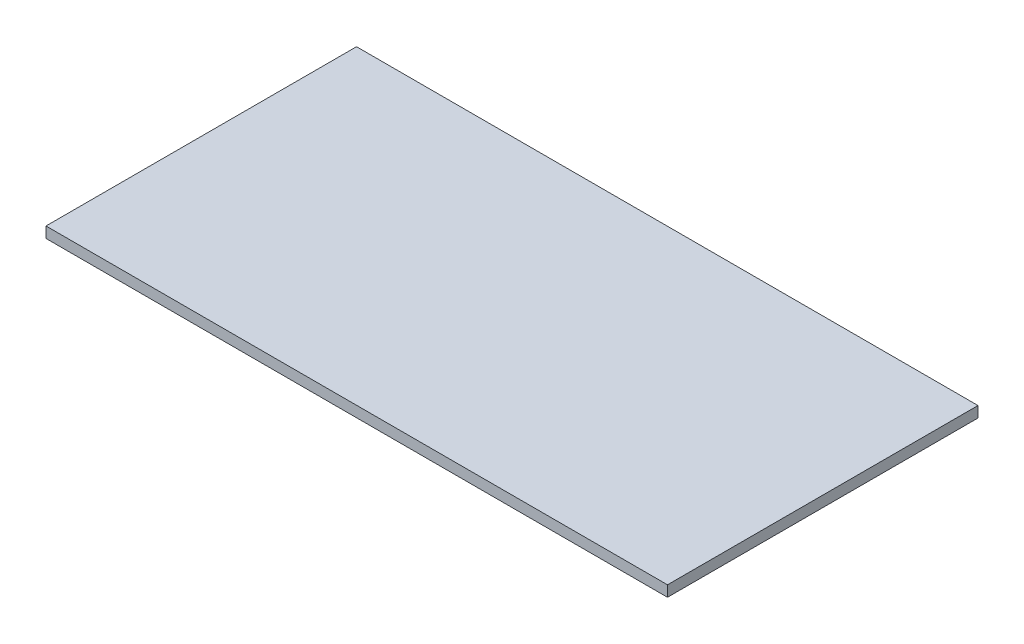
ISO-10303-21;
HEADER;
FILE_DESCRIPTION(('STEP AP214'),'2;1');
FILE_NAME('part.step','',(''),(''),'','','');
FILE_SCHEMA(('AUTOMOTIVE_DESIGN { 1 0 10303 214 1 1 1 1 }'));
ENDSEC;
DATA;
#1=APPLICATION_CONTEXT('core data for automotive mechanical design processes');
#2=APPLICATION_PROTOCOL_DEFINITION('international standard','automotive_design',2000,#1);
#3=PRODUCT_CONTEXT('',#1,'mechanical');
#4=PRODUCT('Part','Part','',(#3));
#5=PRODUCT_RELATED_PRODUCT_CATEGORY('part','',(#4));
#6=PRODUCT_DEFINITION_FORMATION('','',#4);
#7=PRODUCT_DEFINITION_CONTEXT('part definition',#1,'design');
#8=PRODUCT_DEFINITION('design','',#6,#7);
#9=PRODUCT_DEFINITION_SHAPE('','',#8);
#10=(LENGTH_UNIT() NAMED_UNIT(*) SI_UNIT(.MILLI.,.METRE.));
#11=(NAMED_UNIT(*) PLANE_ANGLE_UNIT() SI_UNIT($,.RADIAN.));
#12=(NAMED_UNIT(*) SI_UNIT($,.STERADIAN.) SOLID_ANGLE_UNIT());
#13=UNCERTAINTY_MEASURE_WITH_UNIT(LENGTH_MEASURE(1.E-05),#10,'distance_accuracy_value','');
#14=(GEOMETRIC_REPRESENTATION_CONTEXT(3) GLOBAL_UNCERTAINTY_ASSIGNED_CONTEXT((#13)) GLOBAL_UNIT_ASSIGNED_CONTEXT((#10,
#11,#12)) REPRESENTATION_CONTEXT('',''));
#15=CARTESIAN_POINT('',(0.,0.,0.));
#16=DIRECTION('',(0.,0.,1.));
#17=DIRECTION('',(1.,0.,0.));
#18=AXIS2_PLACEMENT_3D('',#15,#16,#17);
#19=CARTESIAN_POINT('',(65.95,2.3,-32.95));
#20=DIRECTION('',(-1.,0.,0.));
#21=DIRECTION('',(0.,0.,1.));
#22=AXIS2_PLACEMENT_3D('',#19,#20,#21);
#23=PLANE('',#22);
#24=DIRECTION('',(0.,0.,-1.));
#25=VECTOR('',#24,1.);
#26=CARTESIAN_POINT('',(65.95,0.,-32.95));
#27=LINE('',#26,#25);
#28=CARTESIAN_POINT('',(65.95,0.,32.95));
#29=VERTEX_POINT('',#28);
#30=CARTESIAN_POINT('',(65.95,0.,-32.95));
#31=VERTEX_POINT('',#30);
#32=EDGE_CURVE('E111',#29,#31,#27,.T.);
#33=ORIENTED_EDGE('',*,*,#32,.T.);
#34=DIRECTION('',(0.,-1.,0.));
#35=VECTOR('',#34,1.);
#36=CARTESIAN_POINT('',(65.95,2.3,-32.95));
#37=LINE('',#36,#35);
#38=CARTESIAN_POINT('',(65.95,2.3,-32.95));
#39=VERTEX_POINT('',#38);
#40=EDGE_CURVE('E11',#39,#31,#37,.T.);
#41=ORIENTED_EDGE('',*,*,#40,.F.);
#42=DIRECTION('',(0.,0.,-1.));
#43=VECTOR('',#42,1.);
#44=CARTESIAN_POINT('',(65.95,2.3,-32.95));
#45=LINE('',#44,#43);
#46=CARTESIAN_POINT('',(65.95,2.3,32.95));
#47=VERTEX_POINT('',#46);
#48=EDGE_CURVE('E95',#47,#39,#45,.T.);
#49=ORIENTED_EDGE('',*,*,#48,.F.);
#50=DIRECTION('',(0.,-1.,0.));
#51=VECTOR('',#50,1.);
#52=CARTESIAN_POINT('',(65.95,2.3,32.95));
#53=LINE('',#52,#51);
#54=EDGE_CURVE('E107',#47,#29,#53,.T.);
#55=ORIENTED_EDGE('',*,*,#54,.T.);
#56=EDGE_LOOP('',(#33,#41,#49,#55));
#57=FACE_BOUND('',#56,.T.);
#58=ADVANCED_FACE('F43',(#57),#23,.F.);
#59=CARTESIAN_POINT('',(-65.95,2.3,-32.95));
#60=DIRECTION('',(0.,0.,1.));
#61=DIRECTION('',(1.,0.,0.));
#62=AXIS2_PLACEMENT_3D('',#59,#60,#61);
#63=PLANE('',#62);
#64=DIRECTION('',(-1.,0.,0.));
#65=VECTOR('',#64,1.);
#66=CARTESIAN_POINT('',(-65.95,0.,-32.95));
#67=LINE('',#66,#65);
#68=CARTESIAN_POINT('',(-65.95,0.,-32.95));
#69=VERTEX_POINT('',#68);
#70=EDGE_CURVE('E100',#31,#69,#67,.T.);
#71=ORIENTED_EDGE('',*,*,#70,.T.);
#72=DIRECTION('',(0.,-1.,0.));
#73=VECTOR('',#72,1.);
#74=CARTESIAN_POINT('',(-65.95,2.3,-32.95));
#75=LINE('',#74,#73);
#76=CARTESIAN_POINT('',(-65.95,2.3,-32.95));
#77=VERTEX_POINT('',#76);
#78=EDGE_CURVE('E52',#77,#69,#75,.T.);
#79=ORIENTED_EDGE('',*,*,#78,.F.);
#80=DIRECTION('',(-1.,0.,0.));
#81=VECTOR('',#80,1.);
#82=CARTESIAN_POINT('',(-65.95,2.3,-32.95));
#83=LINE('',#82,#81);
#84=EDGE_CURVE('E90',#39,#77,#83,.T.);
#85=ORIENTED_EDGE('',*,*,#84,.F.);
#86=ORIENTED_EDGE('',*,*,#40,.T.);
#87=EDGE_LOOP('',(#71,#79,#85,#86));
#88=FACE_BOUND('',#87,.T.);
#89=ADVANCED_FACE('F99',(#88),#63,.F.);
#90=CARTESIAN_POINT('',(-65.95,2.3,-32.95));
#91=DIRECTION('',(1.,0.,0.));
#92=DIRECTION('',(0.,0.,-1.));
#93=AXIS2_PLACEMENT_3D('',#90,#91,#92);
#94=PLANE('',#93);
#95=DIRECTION('',(0.,0.,1.));
#96=VECTOR('',#95,1.);
#97=CARTESIAN_POINT('',(-65.95,0.,-32.95));
#98=LINE('',#97,#96);
#99=CARTESIAN_POINT('',(-65.95,0.,32.95));
#100=VERTEX_POINT('',#99);
#101=EDGE_CURVE('E77',#69,#100,#98,.T.);
#102=ORIENTED_EDGE('',*,*,#101,.T.);
#103=DIRECTION('',(0.,-1.,0.));
#104=VECTOR('',#103,1.);
#105=CARTESIAN_POINT('',(-65.95,2.3,32.95));
#106=LINE('',#105,#104);
#107=CARTESIAN_POINT('',(-65.95,2.3,32.95));
#108=VERTEX_POINT('',#107);
#109=EDGE_CURVE('E102',#108,#100,#106,.T.);
#110=ORIENTED_EDGE('',*,*,#109,.F.);
#111=DIRECTION('',(0.,0.,1.));
#112=VECTOR('',#111,1.);
#113=CARTESIAN_POINT('',(-65.95,2.3,-32.95));
#114=LINE('',#113,#112);
#115=EDGE_CURVE('E93',#77,#108,#114,.T.);
#116=ORIENTED_EDGE('',*,*,#115,.F.);
#117=ORIENTED_EDGE('',*,*,#78,.T.);
#118=EDGE_LOOP('',(#102,#110,#116,#117));
#119=FACE_BOUND('',#118,.T.);
#120=ADVANCED_FACE('F103',(#119),#94,.F.);
#121=CARTESIAN_POINT('',(-65.95,2.3,32.95));
#122=DIRECTION('',(0.,0.,-1.));
#123=DIRECTION('',(-1.,0.,0.));
#124=AXIS2_PLACEMENT_3D('',#121,#122,#123);
#125=PLANE('',#124);
#126=DIRECTION('',(1.,0.,0.));
#127=VECTOR('',#126,1.);
#128=CARTESIAN_POINT('',(-65.95,0.,32.95));
#129=LINE('',#128,#127);
#130=EDGE_CURVE('E83',#100,#29,#129,.T.);
#131=ORIENTED_EDGE('',*,*,#130,.T.);
#132=ORIENTED_EDGE('',*,*,#54,.F.);
#133=DIRECTION('',(1.,0.,0.));
#134=VECTOR('',#133,1.);
#135=CARTESIAN_POINT('',(-65.95,2.3,32.95));
#136=LINE('',#135,#134);
#137=EDGE_CURVE('E60',#108,#47,#136,.T.);
#138=ORIENTED_EDGE('',*,*,#137,.F.);
#139=ORIENTED_EDGE('',*,*,#109,.T.);
#140=EDGE_LOOP('',(#131,#132,#138,#139));
#141=FACE_BOUND('',#140,.T.);
#142=ADVANCED_FACE('F124',(#141),#125,.F.);
#143=CARTESIAN_POINT('',(0.,2.3,0.));
#144=DIRECTION('',(0.,1.,0.));
#145=DIRECTION('',(0.,0.,1.));
#146=AXIS2_PLACEMENT_3D('',#143,#144,#145);
#147=PLANE('',#146);
#148=ORIENTED_EDGE('',*,*,#48,.T.);
#149=ORIENTED_EDGE('',*,*,#84,.T.);
#150=ORIENTED_EDGE('',*,*,#115,.T.);
#151=ORIENTED_EDGE('',*,*,#137,.T.);
#152=EDGE_LOOP('',(#148,#149,#150,#151));
#153=FACE_BOUND('',#152,.T.);
#154=ADVANCED_FACE('F91',(#153),#147,.T.);
#155=CARTESIAN_POINT('',(0.,0.,0.));
#156=DIRECTION('',(0.,1.,0.));
#157=DIRECTION('',(0.,0.,1.));
#158=AXIS2_PLACEMENT_3D('',#155,#156,#157);
#159=PLANE('',#158);
#160=ORIENTED_EDGE('',*,*,#32,.F.);
#161=ORIENTED_EDGE('',*,*,#130,.F.);
#162=ORIENTED_EDGE('',*,*,#101,.F.);
#163=ORIENTED_EDGE('',*,*,#70,.F.);
#164=EDGE_LOOP('',(#160,#161,#162,#163));
#165=FACE_BOUND('',#164,.T.);
#166=ADVANCED_FACE('F127',(#165),#159,.F.);
#167=CLOSED_SHELL('',(#58,#89,#120,#142,#154,#166));
#168=MANIFOLD_SOLID_BREP('B2',#167);
#169=ADVANCED_BREP_SHAPE_REPRESENTATION('',(#18,#168),#14);
#170=SHAPE_DEFINITION_REPRESENTATION(#9,#169);
ENDSEC;
END-ISO-10303-21;
